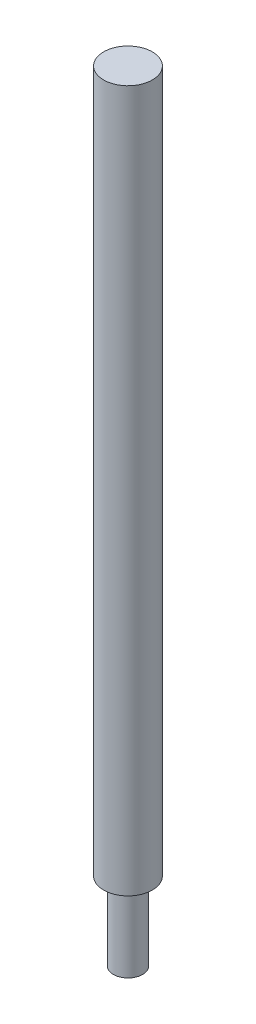
ISO-10303-21;
HEADER;
FILE_DESCRIPTION(('STEP AP214'),'2;1');
FILE_NAME('part.step','',(''),(''),'','','');
FILE_SCHEMA(('AUTOMOTIVE_DESIGN { 1 0 10303 214 1 1 1 1 }'));
ENDSEC;
DATA;
#1=APPLICATION_CONTEXT('core data for automotive mechanical design processes');
#2=APPLICATION_PROTOCOL_DEFINITION('international standard','automotive_design',2000,#1);
#3=PRODUCT_CONTEXT('',#1,'mechanical');
#4=PRODUCT('Part','Part','',(#3));
#5=PRODUCT_RELATED_PRODUCT_CATEGORY('part','',(#4));
#6=PRODUCT_DEFINITION_FORMATION('','',#4);
#7=PRODUCT_DEFINITION_CONTEXT('part definition',#1,'design');
#8=PRODUCT_DEFINITION('design','',#6,#7);
#9=PRODUCT_DEFINITION_SHAPE('','',#8);
#10=(LENGTH_UNIT() NAMED_UNIT(*) SI_UNIT(.MILLI.,.METRE.));
#11=(NAMED_UNIT(*) PLANE_ANGLE_UNIT() SI_UNIT($,.RADIAN.));
#12=(NAMED_UNIT(*) SI_UNIT($,.STERADIAN.) SOLID_ANGLE_UNIT());
#13=UNCERTAINTY_MEASURE_WITH_UNIT(LENGTH_MEASURE(1.E-05),#10,'distance_accuracy_value','');
#14=(GEOMETRIC_REPRESENTATION_CONTEXT(3) GLOBAL_UNCERTAINTY_ASSIGNED_CONTEXT((#13)) GLOBAL_UNIT_ASSIGNED_CONTEXT((#10,
#11,#12)) REPRESENTATION_CONTEXT('',''));
#15=CARTESIAN_POINT('',(0.,0.,0.));
#16=DIRECTION('',(0.,0.,1.));
#17=DIRECTION('',(1.,0.,0.));
#18=AXIS2_PLACEMENT_3D('',#15,#16,#17);
#19=CARTESIAN_POINT('',(0.,8.,0.));
#20=DIRECTION('',(0.,-1.,0.));
#21=DIRECTION('',(0.,0.,-1.));
#22=AXIS2_PLACEMENT_3D('',#19,#20,#21);
#23=CYLINDRICAL_SURFACE('',#22,1.5);
#24=CARTESIAN_POINT('',(0.,8.,0.));
#25=DIRECTION('',(0.,1.,0.));
#26=DIRECTION('',(0.,0.,1.));
#27=AXIS2_PLACEMENT_3D('',#24,#25,#26);
#28=CIRCLE('',#27,1.5);
#29=CARTESIAN_POINT('',(0.,8.,1.5));
#30=VERTEX_POINT('',#29);
#31=EDGE_CURVE('E10',#30,#30,#28,.T.);
#32=ORIENTED_EDGE('',*,*,#31,.F.);
#33=EDGE_LOOP('',(#32));
#34=FACE_BOUND('',#33,.T.);
#35=CARTESIAN_POINT('',(0.,0.,0.));
#36=DIRECTION('',(0.,1.,0.));
#37=DIRECTION('',(0.,0.,1.));
#38=AXIS2_PLACEMENT_3D('',#35,#36,#37);
#39=CIRCLE('',#38,1.5);
#40=CARTESIAN_POINT('',(0.,0.,1.5));
#41=VERTEX_POINT('',#40);
#42=EDGE_CURVE('E33',#41,#41,#39,.T.);
#43=ORIENTED_EDGE('',*,*,#42,.T.);
#44=EDGE_LOOP('',(#43));
#45=FACE_BOUND('',#44,.T.);
#46=ADVANCED_FACE('F30',(#34,#45),#23,.T.);
#47=CARTESIAN_POINT('',(0.,0.,0.));
#48=DIRECTION('',(0.,1.,0.));
#49=DIRECTION('',(0.,0.,1.));
#50=AXIS2_PLACEMENT_3D('',#47,#48,#49);
#51=PLANE('',#50);
#52=ORIENTED_EDGE('',*,*,#42,.F.);
#53=EDGE_LOOP('',(#52));
#54=FACE_BOUND('',#53,.T.);
#55=ADVANCED_FACE('F53',(#54),#51,.F.);
#56=CARTESIAN_POINT('',(0.,80.,0.));
#57=DIRECTION('',(0.,-1.,0.));
#58=DIRECTION('',(0.,0.,-1.));
#59=AXIS2_PLACEMENT_3D('',#56,#57,#58);
#60=CYLINDRICAL_SURFACE('',#59,2.5);
#61=CARTESIAN_POINT('',(0.,80.,0.));
#62=DIRECTION('',(0.,1.,0.));
#63=DIRECTION('',(0.,0.,1.));
#64=AXIS2_PLACEMENT_3D('',#61,#62,#63);
#65=CIRCLE('',#64,2.5);
#66=CARTESIAN_POINT('',(0.,80.,2.5));
#67=VERTEX_POINT('',#66);
#68=EDGE_CURVE('E40',#67,#67,#65,.T.);
#69=ORIENTED_EDGE('',*,*,#68,.F.);
#70=EDGE_LOOP('',(#69));
#71=FACE_BOUND('',#70,.T.);
#72=CARTESIAN_POINT('',(0.,8.,0.));
#73=DIRECTION('',(0.,1.,0.));
#74=DIRECTION('',(0.,0.,1.));
#75=AXIS2_PLACEMENT_3D('',#72,#73,#74);
#76=CIRCLE('',#75,2.5);
#77=CARTESIAN_POINT('',(0.,8.,2.5));
#78=VERTEX_POINT('',#77);
#79=EDGE_CURVE('E42',#78,#78,#76,.T.);
#80=ORIENTED_EDGE('',*,*,#79,.T.);
#81=EDGE_LOOP('',(#80));
#82=FACE_BOUND('',#81,.T.);
#83=ADVANCED_FACE('F50',(#71,#82),#60,.T.);
#84=CARTESIAN_POINT('',(0.,80.,0.));
#85=DIRECTION('',(0.,1.,0.));
#86=DIRECTION('',(0.,0.,1.));
#87=AXIS2_PLACEMENT_3D('',#84,#85,#86);
#88=PLANE('',#87);
#89=ORIENTED_EDGE('',*,*,#68,.T.);
#90=EDGE_LOOP('',(#89));
#91=FACE_BOUND('',#90,.T.);
#92=ADVANCED_FACE('F48',(#91),#88,.T.);
#93=CARTESIAN_POINT('',(0.,8.,0.));
#94=DIRECTION('',(0.,1.,0.));
#95=DIRECTION('',(0.,0.,1.));
#96=AXIS2_PLACEMENT_3D('',#93,#94,#95);
#97=PLANE('',#96);
#98=ORIENTED_EDGE('',*,*,#31,.T.);
#99=EDGE_LOOP('',(#98));
#100=FACE_BOUND('',#99,.T.);
#101=ORIENTED_EDGE('',*,*,#79,.F.);
#102=EDGE_LOOP('',(#101));
#103=FACE_BOUND('',#102,.T.);
#104=ADVANCED_FACE('F57',(#100,#103),#97,.F.);
#105=CLOSED_SHELL('',(#46,#55,#83,#92,#104));
#106=MANIFOLD_SOLID_BREP('B2',#105);
#107=ADVANCED_BREP_SHAPE_REPRESENTATION('',(#18,#106),#14);
#108=SHAPE_DEFINITION_REPRESENTATION(#9,#107);
ENDSEC;
END-ISO-10303-21;
